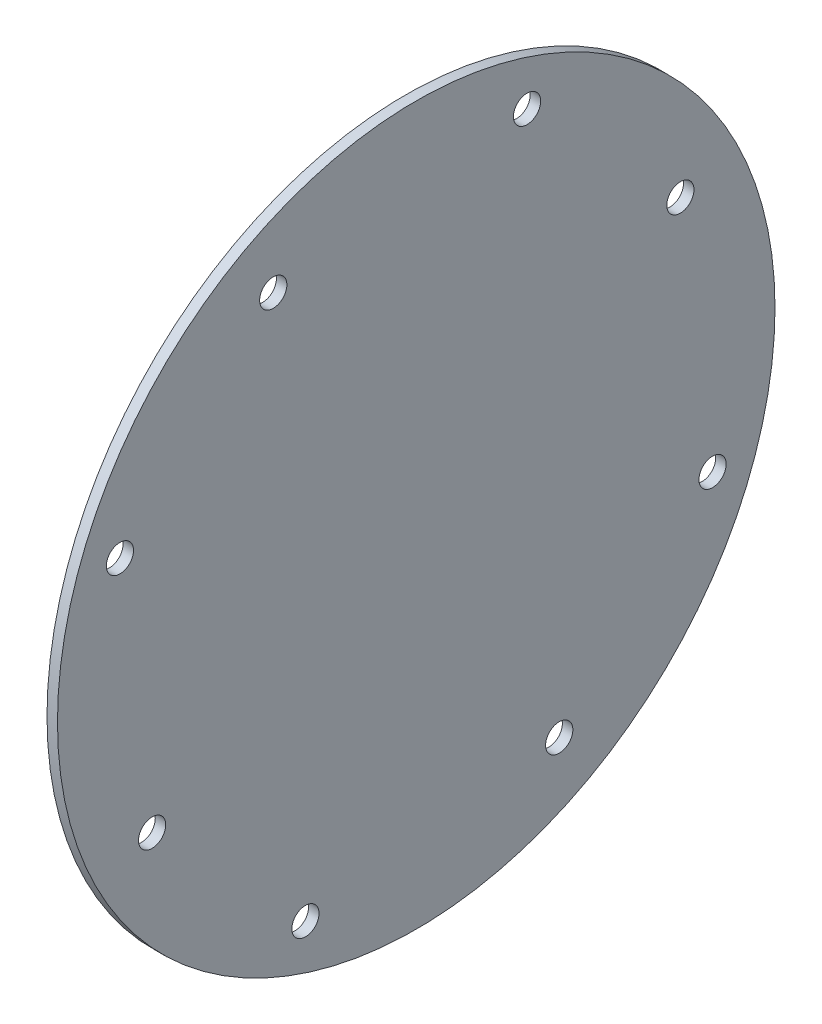
ISO-10303-21;
HEADER;
FILE_DESCRIPTION(('STEP AP214'),'2;1');
FILE_NAME('part.step','',(''),(''),'','','');
FILE_SCHEMA(('AUTOMOTIVE_DESIGN { 1 0 10303 214 1 1 1 1 }'));
ENDSEC;
DATA;
#1=APPLICATION_CONTEXT('core data for automotive mechanical design processes');
#2=APPLICATION_PROTOCOL_DEFINITION('international standard','automotive_design',2000,#1);
#3=PRODUCT_CONTEXT('',#1,'mechanical');
#4=PRODUCT('Part','Part','',(#3));
#5=PRODUCT_RELATED_PRODUCT_CATEGORY('part','',(#4));
#6=PRODUCT_DEFINITION_FORMATION('','',#4);
#7=PRODUCT_DEFINITION_CONTEXT('part definition',#1,'design');
#8=PRODUCT_DEFINITION('design','',#6,#7);
#9=PRODUCT_DEFINITION_SHAPE('','',#8);
#10=(LENGTH_UNIT() NAMED_UNIT(*) SI_UNIT(.MILLI.,.METRE.));
#11=(NAMED_UNIT(*) PLANE_ANGLE_UNIT() SI_UNIT($,.RADIAN.));
#12=(NAMED_UNIT(*) SI_UNIT($,.STERADIAN.) SOLID_ANGLE_UNIT());
#13=UNCERTAINTY_MEASURE_WITH_UNIT(LENGTH_MEASURE(1.E-05),#10,'distance_accuracy_value','');
#14=(GEOMETRIC_REPRESENTATION_CONTEXT(3) GLOBAL_UNCERTAINTY_ASSIGNED_CONTEXT((#13)) GLOBAL_UNIT_ASSIGNED_CONTEXT((#10,
#11,#12)) REPRESENTATION_CONTEXT('',''));
#15=CARTESIAN_POINT('',(0.,0.,0.));
#16=DIRECTION('',(0.,0.,1.));
#17=DIRECTION('',(1.,0.,0.));
#18=AXIS2_PLACEMENT_3D('',#15,#16,#17);
#19=CARTESIAN_POINT('',(2.54,0.,0.));
#20=DIRECTION('',(1.,0.,0.));
#21=DIRECTION('',(0.,0.,-1.));
#22=AXIS2_PLACEMENT_3D('',#19,#20,#21);
#23=PLANE('',#22);
#24=CARTESIAN_POINT('',(2.54,64.045308925058,34.670740795839));
#25=DIRECTION('',(1.,0.,0.));
#26=DIRECTION('',(0.,0.,-1.));
#27=AXIS2_PLACEMENT_3D('',#24,#25,#26);
#28=CIRCLE('',#27,3.302);
#29=CARTESIAN_POINT('',(2.54,64.045308925058,31.368740795839));
#30=VERTEX_POINT('',#29);
#31=EDGE_CURVE('E149',#30,#30,#28,.T.);
#32=ORIENTED_EDGE('',*,*,#31,.F.);
#33=EDGE_LOOP('',(#32));
#34=FACE_BOUND('',#33,.T.);
#35=CARTESIAN_POINT('',(2.54,34.6707407958446,-64.0453089250577));
#36=DIRECTION('',(1.,0.,0.));
#37=DIRECTION('',(0.,0.,-1.));
#38=AXIS2_PLACEMENT_3D('',#35,#36,#37);
#39=CIRCLE('',#38,3.302);
#40=CARTESIAN_POINT('',(2.54,34.6707407958446,-67.3473089250577));
#41=VERTEX_POINT('',#40);
#42=EDGE_CURVE('E133',#41,#41,#39,.T.);
#43=ORIENTED_EDGE('',*,*,#42,.F.);
#44=EDGE_LOOP('',(#43));
#45=FACE_BOUND('',#44,.T.);
#46=CARTESIAN_POINT('',(2.54,-64.0453089250523,-34.6707407958442));
#47=DIRECTION('',(1.,0.,0.));
#48=DIRECTION('',(0.,0.,-1.));
#49=AXIS2_PLACEMENT_3D('',#46,#47,#48);
#50=CIRCLE('',#49,3.302);
#51=CARTESIAN_POINT('',(2.54,-64.0453089250523,-37.9727407958442));
#52=VERTEX_POINT('',#51);
#53=EDGE_CURVE('E117',#52,#52,#50,.T.);
#54=ORIENTED_EDGE('',*,*,#53,.F.);
#55=EDGE_LOOP('',(#54));
#56=FACE_BOUND('',#55,.T.);
#57=CARTESIAN_POINT('',(2.54,-34.6707407958387,64.0453089250526));
#58=DIRECTION('',(1.,0.,0.));
#59=DIRECTION('',(0.,0.,-1.));
#60=AXIS2_PLACEMENT_3D('',#57,#58,#59);
#61=CIRCLE('',#60,3.302);
#62=CARTESIAN_POINT('',(2.54,-34.6707407958387,60.7433089250526));
#63=VERTEX_POINT('',#62);
#64=EDGE_CURVE('E103',#63,#63,#61,.T.);
#65=ORIENTED_EDGE('',*,*,#64,.F.);
#66=EDGE_LOOP('',(#65));
#67=FACE_BOUND('',#66,.T.);
#68=CARTESIAN_POINT('',(2.54,0.,0.));
#69=DIRECTION('',(1.,0.,0.));
#70=DIRECTION('',(0.,0.,-1.));
#71=AXIS2_PLACEMENT_3D('',#68,#69,#70);
#72=CIRCLE('',#71,86.995);
#73=CARTESIAN_POINT('',(2.54,0.,-86.995));
#74=VERTEX_POINT('',#73);
#75=EDGE_CURVE('E11',#74,#74,#72,.T.);
#76=ORIENTED_EDGE('',*,*,#75,.T.);
#77=EDGE_LOOP('',(#76));
#78=FACE_BOUND('',#77,.T.);
#79=CARTESIAN_POINT('',(2.54,-71.849001137065,26.8670485838263));
#80=DIRECTION('',(1.,0.,0.));
#81=DIRECTION('',(0.,0.,-1.));
#82=AXIS2_PLACEMENT_3D('',#79,#80,#81);
#83=CIRCLE('',#82,3.302);
#84=CARTESIAN_POINT('',(2.54,-71.849001137065,23.5650485838263));
#85=VERTEX_POINT('',#84);
#86=EDGE_CURVE('E109',#85,#85,#83,.T.);
#87=ORIENTED_EDGE('',*,*,#86,.F.);
#88=EDGE_LOOP('',(#87));
#89=FACE_BOUND('',#88,.T.);
#90=CARTESIAN_POINT('',(2.54,-26.8670485838259,-71.8490011370705));
#91=DIRECTION('',(1.,0.,0.));
#92=DIRECTION('',(0.,0.,-1.));
#93=AXIS2_PLACEMENT_3D('',#90,#91,#92);
#94=CIRCLE('',#93,3.302);
#95=CARTESIAN_POINT('',(2.54,-26.8670485838259,-75.1510011370705));
#96=VERTEX_POINT('',#95);
#97=EDGE_CURVE('E125',#96,#96,#94,.T.);
#98=ORIENTED_EDGE('',*,*,#97,.F.);
#99=EDGE_LOOP('',(#98));
#100=FACE_BOUND('',#99,.T.);
#101=CARTESIAN_POINT('',(2.54,71.8490011370709,-26.8670485838314));
#102=DIRECTION('',(1.,0.,0.));
#103=DIRECTION('',(0.,0.,-1.));
#104=AXIS2_PLACEMENT_3D('',#101,#102,#103);
#105=CIRCLE('',#104,3.302);
#106=CARTESIAN_POINT('',(2.54,71.8490011370709,-30.1690485838314));
#107=VERTEX_POINT('',#106);
#108=EDGE_CURVE('E141',#107,#107,#105,.T.);
#109=ORIENTED_EDGE('',*,*,#108,.F.);
#110=EDGE_LOOP('',(#109));
#111=FACE_BOUND('',#110,.T.);
#112=CARTESIAN_POINT('',(2.54,26.8670485838318,71.8490011370654));
#113=DIRECTION('',(1.,0.,0.));
#114=DIRECTION('',(0.,0.,-1.));
#115=AXIS2_PLACEMENT_3D('',#112,#113,#114);
#116=CIRCLE('',#115,3.302);
#117=CARTESIAN_POINT('',(2.54,26.8670485838318,68.5470011370654));
#118=VERTEX_POINT('',#117);
#119=EDGE_CURVE('E157',#118,#118,#116,.T.);
#120=ORIENTED_EDGE('',*,*,#119,.F.);
#121=EDGE_LOOP('',(#120));
#122=FACE_BOUND('',#121,.T.);
#123=ADVANCED_FACE('F90',(#34,#45,#56,#67,#78,#89,#100,#111,#122),#23,.T.);
#124=CARTESIAN_POINT('',(0.,0.,0.));
#125=DIRECTION('',(1.,0.,0.));
#126=DIRECTION('',(0.,0.,-1.));
#127=AXIS2_PLACEMENT_3D('',#124,#125,#126);
#128=PLANE('',#127);
#129=CARTESIAN_POINT('',(0.,0.,0.));
#130=DIRECTION('',(1.,0.,0.));
#131=DIRECTION('',(0.,0.,-1.));
#132=AXIS2_PLACEMENT_3D('',#129,#130,#131);
#133=CIRCLE('',#132,86.995);
#134=CARTESIAN_POINT('',(0.,0.,-86.995));
#135=VERTEX_POINT('',#134);
#136=EDGE_CURVE('E94',#135,#135,#133,.T.);
#137=ORIENTED_EDGE('',*,*,#136,.F.);
#138=EDGE_LOOP('',(#137));
#139=FACE_BOUND('',#138,.T.);
#140=CARTESIAN_POINT('',(0.,-34.6707407958387,64.0453089250526));
#141=DIRECTION('',(1.,0.,0.));
#142=DIRECTION('',(0.,0.,-1.));
#143=AXIS2_PLACEMENT_3D('',#140,#141,#142);
#144=CIRCLE('',#143,3.302);
#145=CARTESIAN_POINT('',(0.,-34.6707407958387,60.7433089250526));
#146=VERTEX_POINT('',#145);
#147=EDGE_CURVE('E105',#146,#146,#144,.T.);
#148=ORIENTED_EDGE('',*,*,#147,.T.);
#149=EDGE_LOOP('',(#148));
#150=FACE_BOUND('',#149,.T.);
#151=CARTESIAN_POINT('',(0.,-71.849001137065,26.8670485838263));
#152=DIRECTION('',(1.,0.,0.));
#153=DIRECTION('',(0.,0.,-1.));
#154=AXIS2_PLACEMENT_3D('',#151,#152,#153);
#155=CIRCLE('',#154,3.302);
#156=CARTESIAN_POINT('',(0.,-71.849001137065,23.5650485838263));
#157=VERTEX_POINT('',#156);
#158=EDGE_CURVE('E113',#157,#157,#155,.T.);
#159=ORIENTED_EDGE('',*,*,#158,.T.);
#160=EDGE_LOOP('',(#159));
#161=FACE_BOUND('',#160,.T.);
#162=CARTESIAN_POINT('',(0.,-64.0453089250523,-34.6707407958442));
#163=DIRECTION('',(1.,0.,0.));
#164=DIRECTION('',(0.,0.,-1.));
#165=AXIS2_PLACEMENT_3D('',#162,#163,#164);
#166=CIRCLE('',#165,3.302);
#167=CARTESIAN_POINT('',(0.,-64.0453089250523,-37.9727407958442));
#168=VERTEX_POINT('',#167);
#169=EDGE_CURVE('E121',#168,#168,#166,.T.);
#170=ORIENTED_EDGE('',*,*,#169,.T.);
#171=EDGE_LOOP('',(#170));
#172=FACE_BOUND('',#171,.T.);
#173=CARTESIAN_POINT('',(0.,-26.8670485838259,-71.8490011370705));
#174=DIRECTION('',(1.,0.,0.));
#175=DIRECTION('',(0.,0.,-1.));
#176=AXIS2_PLACEMENT_3D('',#173,#174,#175);
#177=CIRCLE('',#176,3.302);
#178=CARTESIAN_POINT('',(0.,-26.8670485838259,-75.1510011370705));
#179=VERTEX_POINT('',#178);
#180=EDGE_CURVE('E129',#179,#179,#177,.T.);
#181=ORIENTED_EDGE('',*,*,#180,.T.);
#182=EDGE_LOOP('',(#181));
#183=FACE_BOUND('',#182,.T.);
#184=CARTESIAN_POINT('',(0.,34.6707407958446,-64.0453089250577));
#185=DIRECTION('',(1.,0.,0.));
#186=DIRECTION('',(0.,0.,-1.));
#187=AXIS2_PLACEMENT_3D('',#184,#185,#186);
#188=CIRCLE('',#187,3.302);
#189=CARTESIAN_POINT('',(0.,34.6707407958446,-67.3473089250577));
#190=VERTEX_POINT('',#189);
#191=EDGE_CURVE('E137',#190,#190,#188,.T.);
#192=ORIENTED_EDGE('',*,*,#191,.T.);
#193=EDGE_LOOP('',(#192));
#194=FACE_BOUND('',#193,.T.);
#195=CARTESIAN_POINT('',(0.,71.8490011370709,-26.8670485838314));
#196=DIRECTION('',(1.,0.,0.));
#197=DIRECTION('',(0.,0.,-1.));
#198=AXIS2_PLACEMENT_3D('',#195,#196,#197);
#199=CIRCLE('',#198,3.302);
#200=CARTESIAN_POINT('',(0.,71.8490011370709,-30.1690485838314));
#201=VERTEX_POINT('',#200);
#202=EDGE_CURVE('E145',#201,#201,#199,.T.);
#203=ORIENTED_EDGE('',*,*,#202,.T.);
#204=EDGE_LOOP('',(#203));
#205=FACE_BOUND('',#204,.T.);
#206=CARTESIAN_POINT('',(0.,64.045308925058,34.670740795839));
#207=DIRECTION('',(1.,0.,0.));
#208=DIRECTION('',(0.,0.,-1.));
#209=AXIS2_PLACEMENT_3D('',#206,#207,#208);
#210=CIRCLE('',#209,3.302);
#211=CARTESIAN_POINT('',(0.,64.045308925058,31.368740795839));
#212=VERTEX_POINT('',#211);
#213=EDGE_CURVE('E153',#212,#212,#210,.T.);
#214=ORIENTED_EDGE('',*,*,#213,.T.);
#215=EDGE_LOOP('',(#214));
#216=FACE_BOUND('',#215,.T.);
#217=CARTESIAN_POINT('',(0.,26.8670485838318,71.8490011370654));
#218=DIRECTION('',(1.,0.,0.));
#219=DIRECTION('',(0.,0.,-1.));
#220=AXIS2_PLACEMENT_3D('',#217,#218,#219);
#221=CIRCLE('',#220,3.302);
#222=CARTESIAN_POINT('',(0.,26.8670485838318,68.5470011370654));
#223=VERTEX_POINT('',#222);
#224=EDGE_CURVE('E161',#223,#223,#221,.T.);
#225=ORIENTED_EDGE('',*,*,#224,.T.);
#226=EDGE_LOOP('',(#225));
#227=FACE_BOUND('',#226,.T.);
#228=ADVANCED_FACE('F173',(#139,#150,#161,#172,#183,#194,#205,#216,#227),#128,.F.);
#229=CARTESIAN_POINT('',(2.54,0.,0.));
#230=DIRECTION('',(-1.,0.,0.));
#231=DIRECTION('',(0.,0.,1.));
#232=AXIS2_PLACEMENT_3D('',#229,#230,#231);
#233=CYLINDRICAL_SURFACE('',#232,86.995);
#234=ORIENTED_EDGE('',*,*,#75,.F.);
#235=EDGE_LOOP('',(#234));
#236=FACE_BOUND('',#235,.T.);
#237=ORIENTED_EDGE('',*,*,#136,.T.);
#238=EDGE_LOOP('',(#237));
#239=FACE_BOUND('',#238,.T.);
#240=ADVANCED_FACE('F92',(#236,#239),#233,.T.);
#241=CARTESIAN_POINT('',(2.54,-34.6707407958387,64.0453089250526));
#242=DIRECTION('',(-1.,0.,0.));
#243=DIRECTION('',(0.,0.,1.));
#244=AXIS2_PLACEMENT_3D('',#241,#242,#243);
#245=CYLINDRICAL_SURFACE('',#244,3.302);
#246=ORIENTED_EDGE('',*,*,#64,.T.);
#247=EDGE_LOOP('',(#246));
#248=FACE_BOUND('',#247,.T.);
#249=ORIENTED_EDGE('',*,*,#147,.F.);
#250=EDGE_LOOP('',(#249));
#251=FACE_BOUND('',#250,.T.);
#252=ADVANCED_FACE('F183',(#248,#251),#245,.F.);
#253=CARTESIAN_POINT('',(2.54,-71.849001137065,26.8670485838263));
#254=DIRECTION('',(-1.,0.,0.));
#255=DIRECTION('',(0.,0.,1.));
#256=AXIS2_PLACEMENT_3D('',#253,#254,#255);
#257=CYLINDRICAL_SURFACE('',#256,3.302);
#258=ORIENTED_EDGE('',*,*,#86,.T.);
#259=EDGE_LOOP('',(#258));
#260=FACE_BOUND('',#259,.T.);
#261=ORIENTED_EDGE('',*,*,#158,.F.);
#262=EDGE_LOOP('',(#261));
#263=FACE_BOUND('',#262,.T.);
#264=ADVANCED_FACE('F186',(#260,#263),#257,.F.);
#265=CARTESIAN_POINT('',(2.54,-64.0453089250523,-34.6707407958442));
#266=DIRECTION('',(-1.,0.,0.));
#267=DIRECTION('',(0.,0.,1.));
#268=AXIS2_PLACEMENT_3D('',#265,#266,#267);
#269=CYLINDRICAL_SURFACE('',#268,3.302);
#270=ORIENTED_EDGE('',*,*,#53,.T.);
#271=EDGE_LOOP('',(#270));
#272=FACE_BOUND('',#271,.T.);
#273=ORIENTED_EDGE('',*,*,#169,.F.);
#274=EDGE_LOOP('',(#273));
#275=FACE_BOUND('',#274,.T.);
#276=ADVANCED_FACE('F190',(#272,#275),#269,.F.);
#277=CARTESIAN_POINT('',(2.54,-26.8670485838259,-71.8490011370705));
#278=DIRECTION('',(-1.,0.,0.));
#279=DIRECTION('',(0.,0.,1.));
#280=AXIS2_PLACEMENT_3D('',#277,#278,#279);
#281=CYLINDRICAL_SURFACE('',#280,3.302);
#282=ORIENTED_EDGE('',*,*,#97,.T.);
#283=EDGE_LOOP('',(#282));
#284=FACE_BOUND('',#283,.T.);
#285=ORIENTED_EDGE('',*,*,#180,.F.);
#286=EDGE_LOOP('',(#285));
#287=FACE_BOUND('',#286,.T.);
#288=ADVANCED_FACE('F194',(#284,#287),#281,.F.);
#289=CARTESIAN_POINT('',(2.54,34.6707407958446,-64.0453089250577));
#290=DIRECTION('',(-1.,0.,0.));
#291=DIRECTION('',(0.,0.,1.));
#292=AXIS2_PLACEMENT_3D('',#289,#290,#291);
#293=CYLINDRICAL_SURFACE('',#292,3.302);
#294=ORIENTED_EDGE('',*,*,#42,.T.);
#295=EDGE_LOOP('',(#294));
#296=FACE_BOUND('',#295,.T.);
#297=ORIENTED_EDGE('',*,*,#191,.F.);
#298=EDGE_LOOP('',(#297));
#299=FACE_BOUND('',#298,.T.);
#300=ADVANCED_FACE('F198',(#296,#299),#293,.F.);
#301=CARTESIAN_POINT('',(2.54,71.8490011370709,-26.8670485838314));
#302=DIRECTION('',(-1.,0.,0.));
#303=DIRECTION('',(0.,0.,1.));
#304=AXIS2_PLACEMENT_3D('',#301,#302,#303);
#305=CYLINDRICAL_SURFACE('',#304,3.302);
#306=ORIENTED_EDGE('',*,*,#108,.T.);
#307=EDGE_LOOP('',(#306));
#308=FACE_BOUND('',#307,.T.);
#309=ORIENTED_EDGE('',*,*,#202,.F.);
#310=EDGE_LOOP('',(#309));
#311=FACE_BOUND('',#310,.T.);
#312=ADVANCED_FACE('F202',(#308,#311),#305,.F.);
#313=CARTESIAN_POINT('',(2.54,64.045308925058,34.670740795839));
#314=DIRECTION('',(-1.,0.,0.));
#315=DIRECTION('',(0.,0.,1.));
#316=AXIS2_PLACEMENT_3D('',#313,#314,#315);
#317=CYLINDRICAL_SURFACE('',#316,3.302);
#318=ORIENTED_EDGE('',*,*,#31,.T.);
#319=EDGE_LOOP('',(#318));
#320=FACE_BOUND('',#319,.T.);
#321=ORIENTED_EDGE('',*,*,#213,.F.);
#322=EDGE_LOOP('',(#321));
#323=FACE_BOUND('',#322,.T.);
#324=ADVANCED_FACE('F206',(#320,#323),#317,.F.);
#325=CARTESIAN_POINT('',(2.54,26.8670485838318,71.8490011370654));
#326=DIRECTION('',(-1.,0.,0.));
#327=DIRECTION('',(0.,0.,1.));
#328=AXIS2_PLACEMENT_3D('',#325,#326,#327);
#329=CYLINDRICAL_SURFACE('',#328,3.302);
#330=ORIENTED_EDGE('',*,*,#119,.T.);
#331=EDGE_LOOP('',(#330));
#332=FACE_BOUND('',#331,.T.);
#333=ORIENTED_EDGE('',*,*,#224,.F.);
#334=EDGE_LOOP('',(#333));
#335=FACE_BOUND('',#334,.T.);
#336=ADVANCED_FACE('F169',(#332,#335),#329,.F.);
#337=CLOSED_SHELL('',(#123,#228,#240,#252,#264,#276,#288,#300,#312,#324,#336));
#338=MANIFOLD_SOLID_BREP('B2',#337);
#339=ADVANCED_BREP_SHAPE_REPRESENTATION('',(#18,#338),#14);
#340=SHAPE_DEFINITION_REPRESENTATION(#9,#339);
ENDSEC;
END-ISO-10303-21;
